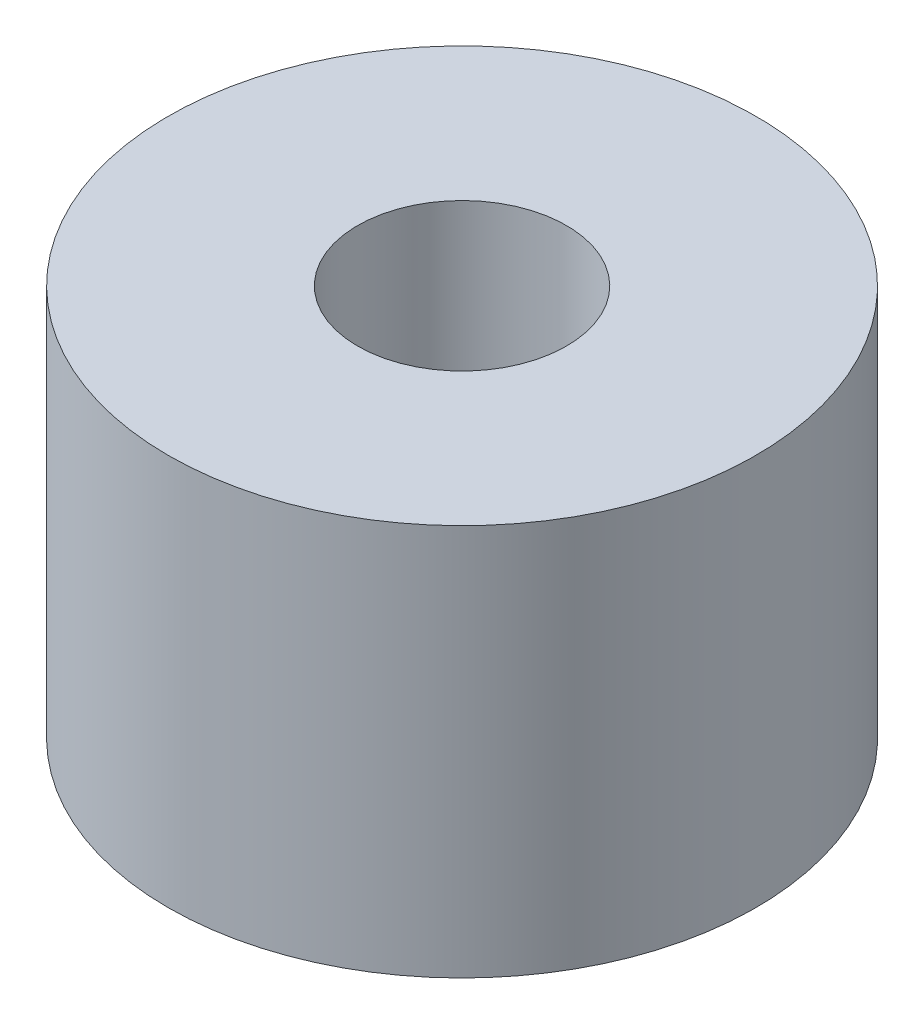
ISO-10303-21;
HEADER;
FILE_DESCRIPTION(('STEP AP214'),'2;1');
FILE_NAME('part.step','',(''),(''),'','','');
FILE_SCHEMA(('AUTOMOTIVE_DESIGN { 1 0 10303 214 1 1 1 1 }'));
ENDSEC;
DATA;
#1=APPLICATION_CONTEXT('core data for automotive mechanical design processes');
#2=APPLICATION_PROTOCOL_DEFINITION('international standard','automotive_design',2000,#1);
#3=PRODUCT_CONTEXT('',#1,'mechanical');
#4=PRODUCT('Part','Part','',(#3));
#5=PRODUCT_RELATED_PRODUCT_CATEGORY('part','',(#4));
#6=PRODUCT_DEFINITION_FORMATION('','',#4);
#7=PRODUCT_DEFINITION_CONTEXT('part definition',#1,'design');
#8=PRODUCT_DEFINITION('design','',#6,#7);
#9=PRODUCT_DEFINITION_SHAPE('','',#8);
#10=(LENGTH_UNIT() NAMED_UNIT(*) SI_UNIT(.MILLI.,.METRE.));
#11=(NAMED_UNIT(*) PLANE_ANGLE_UNIT() SI_UNIT($,.RADIAN.));
#12=(NAMED_UNIT(*) SI_UNIT($,.STERADIAN.) SOLID_ANGLE_UNIT());
#13=UNCERTAINTY_MEASURE_WITH_UNIT(LENGTH_MEASURE(1.E-05),#10,'distance_accuracy_value','');
#14=(GEOMETRIC_REPRESENTATION_CONTEXT(3) GLOBAL_UNCERTAINTY_ASSIGNED_CONTEXT((#13)) GLOBAL_UNIT_ASSIGNED_CONTEXT((#10,
#11,#12)) REPRESENTATION_CONTEXT('',''));
#15=CARTESIAN_POINT('',(0.,0.,0.));
#16=DIRECTION('',(0.,0.,1.));
#17=DIRECTION('',(1.,0.,0.));
#18=AXIS2_PLACEMENT_3D('',#15,#16,#17);
#19=CARTESIAN_POINT('',(0.,15.,0.));
#20=DIRECTION('',(0.,-1.,0.));
#21=DIRECTION('',(0.,0.,-1.));
#22=AXIS2_PLACEMENT_3D('',#19,#20,#21);
#23=CYLINDRICAL_SURFACE('',#22,2.5);
#24=CARTESIAN_POINT('',(0.,0.,0.));
#25=DIRECTION('',(0.,1.,0.));
#26=DIRECTION('',(0.,0.,1.));
#27=AXIS2_PLACEMENT_3D('',#24,#25,#26);
#28=CIRCLE('',#27,2.5);
#29=CARTESIAN_POINT('',(0.,0.,2.5));
#30=VERTEX_POINT('',#29);
#31=EDGE_CURVE('E52',#30,#30,#28,.T.);
#32=ORIENTED_EDGE('',*,*,#31,.F.);
#33=EDGE_LOOP('',(#32));
#34=FACE_BOUND('',#33,.T.);
#35=CARTESIAN_POINT('',(0.,5.,0.));
#36=DIRECTION('',(0.,1.,0.));
#37=DIRECTION('',(0.,0.,1.));
#38=AXIS2_PLACEMENT_3D('',#35,#36,#37);
#39=CIRCLE('',#38,2.5);
#40=CARTESIAN_POINT('',(0.,5.,2.5));
#41=VERTEX_POINT('',#40);
#42=EDGE_CURVE('E41',#41,#41,#39,.T.);
#43=ORIENTED_EDGE('',*,*,#42,.T.);
#44=EDGE_LOOP('',(#43));
#45=FACE_BOUND('',#44,.T.);
#46=ADVANCED_FACE('F37',(#34,#45),#23,.F.);
#47=CARTESIAN_POINT('',(0.,15.,0.));
#48=DIRECTION('',(0.,1.,0.));
#49=DIRECTION('',(0.,0.,1.));
#50=AXIS2_PLACEMENT_3D('',#47,#48,#49);
#51=PLANE('',#50);
#52=CARTESIAN_POINT('',(0.,15.,0.));
#53=DIRECTION('',(0.,1.,0.));
#54=DIRECTION('',(0.,0.,1.));
#55=AXIS2_PLACEMENT_3D('',#52,#53,#54);
#56=CIRCLE('',#55,4.);
#57=CARTESIAN_POINT('',(0.,15.,4.));
#58=VERTEX_POINT('',#57);
#59=EDGE_CURVE('E57',#58,#58,#56,.T.);
#60=ORIENTED_EDGE('',*,*,#59,.F.);
#61=EDGE_LOOP('',(#60));
#62=FACE_BOUND('',#61,.T.);
#63=CARTESIAN_POINT('',(0.,15.,0.));
#64=DIRECTION('',(0.,1.,0.));
#65=DIRECTION('',(0.,0.,1.));
#66=AXIS2_PLACEMENT_3D('',#63,#64,#65);
#67=CIRCLE('',#66,11.25);
#68=CARTESIAN_POINT('',(0.,15.,11.25));
#69=VERTEX_POINT('',#68);
#70=EDGE_CURVE('E10',#69,#69,#67,.T.);
#71=ORIENTED_EDGE('',*,*,#70,.T.);
#72=EDGE_LOOP('',(#71));
#73=FACE_BOUND('',#72,.T.);
#74=ADVANCED_FACE('F81',(#62,#73),#51,.T.);
#75=CARTESIAN_POINT('',(0.,0.,0.));
#76=DIRECTION('',(0.,1.,0.));
#77=DIRECTION('',(0.,0.,1.));
#78=AXIS2_PLACEMENT_3D('',#75,#76,#77);
#79=PLANE('',#78);
#80=CARTESIAN_POINT('',(0.,0.,0.));
#81=DIRECTION('',(0.,1.,0.));
#82=DIRECTION('',(0.,0.,1.));
#83=AXIS2_PLACEMENT_3D('',#80,#81,#82);
#84=CIRCLE('',#83,11.25);
#85=CARTESIAN_POINT('',(0.,0.,11.25));
#86=VERTEX_POINT('',#85);
#87=EDGE_CURVE('E46',#86,#86,#84,.T.);
#88=ORIENTED_EDGE('',*,*,#87,.F.);
#89=EDGE_LOOP('',(#88));
#90=FACE_BOUND('',#89,.T.);
#91=ORIENTED_EDGE('',*,*,#31,.T.);
#92=EDGE_LOOP('',(#91));
#93=FACE_BOUND('',#92,.T.);
#94=ADVANCED_FACE('F87',(#90,#93),#79,.F.);
#95=CARTESIAN_POINT('',(0.,15.,0.));
#96=DIRECTION('',(0.,-1.,0.));
#97=DIRECTION('',(0.,0.,-1.));
#98=AXIS2_PLACEMENT_3D('',#95,#96,#97);
#99=CYLINDRICAL_SURFACE('',#98,11.25);
#100=ORIENTED_EDGE('',*,*,#70,.F.);
#101=EDGE_LOOP('',(#100));
#102=FACE_BOUND('',#101,.T.);
#103=ORIENTED_EDGE('',*,*,#87,.T.);
#104=EDGE_LOOP('',(#103));
#105=FACE_BOUND('',#104,.T.);
#106=ADVANCED_FACE('F39',(#102,#105),#99,.T.);
#107=CARTESIAN_POINT('',(0.,5.,0.));
#108=DIRECTION('',(0.,1.,0.));
#109=DIRECTION('',(0.,0.,1.));
#110=AXIS2_PLACEMENT_3D('',#107,#108,#109);
#111=CYLINDRICAL_SURFACE('',#110,4.);
#112=CARTESIAN_POINT('',(0.,5.,0.));
#113=DIRECTION('',(0.,1.,0.));
#114=DIRECTION('',(0.,0.,1.));
#115=AXIS2_PLACEMENT_3D('',#112,#113,#114);
#116=CIRCLE('',#115,4.);
#117=CARTESIAN_POINT('',(0.,5.,4.));
#118=VERTEX_POINT('',#117);
#119=EDGE_CURVE('E61',#118,#118,#116,.T.);
#120=ORIENTED_EDGE('',*,*,#119,.F.);
#121=EDGE_LOOP('',(#120));
#122=FACE_BOUND('',#121,.T.);
#123=ORIENTED_EDGE('',*,*,#59,.T.);
#124=EDGE_LOOP('',(#123));
#125=FACE_BOUND('',#124,.T.);
#126=ADVANCED_FACE('F73',(#122,#125),#111,.F.);
#127=CARTESIAN_POINT('',(0.,5.,0.));
#128=DIRECTION('',(0.,1.,0.));
#129=DIRECTION('',(0.,0.,1.));
#130=AXIS2_PLACEMENT_3D('',#127,#128,#129);
#131=PLANE('',#130);
#132=ORIENTED_EDGE('',*,*,#42,.F.);
#133=EDGE_LOOP('',(#132));
#134=FACE_BOUND('',#133,.T.);
#135=ORIENTED_EDGE('',*,*,#119,.T.);
#136=EDGE_LOOP('',(#135));
#137=FACE_BOUND('',#136,.T.);
#138=ADVANCED_FACE('F71',(#134,#137),#131,.T.);
#139=CLOSED_SHELL('',(#46,#74,#94,#106,#126,#138));
#140=MANIFOLD_SOLID_BREP('B2',#139);
#141=ADVANCED_BREP_SHAPE_REPRESENTATION('',(#18,#140),#14);
#142=SHAPE_DEFINITION_REPRESENTATION(#9,#141);
ENDSEC;
END-ISO-10303-21;
